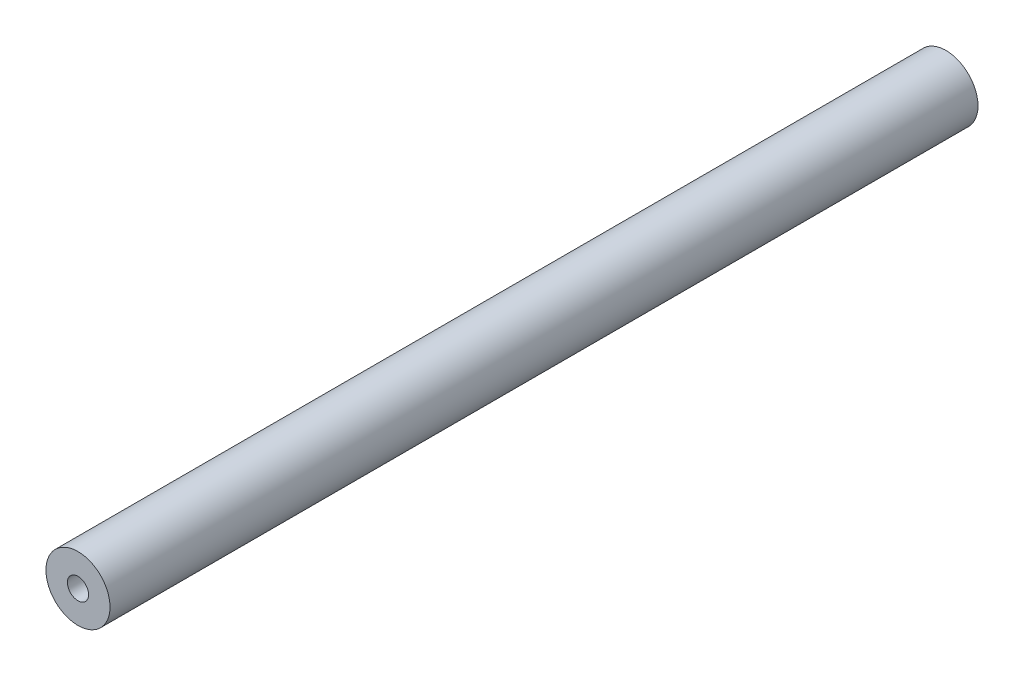
ISO-10303-21;
HEADER;
FILE_DESCRIPTION(('STEP AP214'),'2;1');
FILE_NAME('part.step','',(''),(''),'','','');
FILE_SCHEMA(('AUTOMOTIVE_DESIGN { 1 0 10303 214 1 1 1 1 }'));
ENDSEC;
DATA;
#1=APPLICATION_CONTEXT('core data for automotive mechanical design processes');
#2=APPLICATION_PROTOCOL_DEFINITION('international standard','automotive_design',2000,#1);
#3=PRODUCT_CONTEXT('',#1,'mechanical');
#4=PRODUCT('Part','Part','',(#3));
#5=PRODUCT_RELATED_PRODUCT_CATEGORY('part','',(#4));
#6=PRODUCT_DEFINITION_FORMATION('','',#4);
#7=PRODUCT_DEFINITION_CONTEXT('part definition',#1,'design');
#8=PRODUCT_DEFINITION('design','',#6,#7);
#9=PRODUCT_DEFINITION_SHAPE('','',#8);
#10=(LENGTH_UNIT() NAMED_UNIT(*) SI_UNIT(.MILLI.,.METRE.));
#11=(NAMED_UNIT(*) PLANE_ANGLE_UNIT() SI_UNIT($,.RADIAN.));
#12=(NAMED_UNIT(*) SI_UNIT($,.STERADIAN.) SOLID_ANGLE_UNIT());
#13=UNCERTAINTY_MEASURE_WITH_UNIT(LENGTH_MEASURE(1.E-05),#10,'distance_accuracy_value','');
#14=(GEOMETRIC_REPRESENTATION_CONTEXT(3) GLOBAL_UNCERTAINTY_ASSIGNED_CONTEXT((#13)) GLOBAL_UNIT_ASSIGNED_CONTEXT((#10,
#11,#12)) REPRESENTATION_CONTEXT('',''));
#15=CARTESIAN_POINT('',(0.,0.,0.));
#16=DIRECTION('',(0.,0.,1.));
#17=DIRECTION('',(1.,0.,0.));
#18=AXIS2_PLACEMENT_3D('',#15,#16,#17);
#19=CARTESIAN_POINT('',(0.,0.,135.5));
#20=DIRECTION('',(0.,0.,-1.));
#21=DIRECTION('',(-1.,0.,0.));
#22=AXIS2_PLACEMENT_3D('',#19,#20,#21);
#23=CYLINDRICAL_SURFACE('',#22,5.);
#24=CARTESIAN_POINT('',(0.,0.,135.5));
#25=DIRECTION('',(0.,0.,1.));
#26=DIRECTION('',(1.,0.,0.));
#27=AXIS2_PLACEMENT_3D('',#24,#25,#26);
#28=CIRCLE('',#27,5.);
#29=CARTESIAN_POINT('',(5.,0.,135.5));
#30=VERTEX_POINT('',#29);
#31=EDGE_CURVE('E10',#30,#30,#28,.T.);
#32=ORIENTED_EDGE('',*,*,#31,.F.);
#33=EDGE_LOOP('',(#32));
#34=FACE_BOUND('',#33,.T.);
#35=CARTESIAN_POINT('',(0.,0.,0.));
#36=DIRECTION('',(0.,0.,1.));
#37=DIRECTION('',(1.,0.,0.));
#38=AXIS2_PLACEMENT_3D('',#35,#36,#37);
#39=CIRCLE('',#38,5.);
#40=CARTESIAN_POINT('',(5.,0.,0.));
#41=VERTEX_POINT('',#40);
#42=EDGE_CURVE('E36',#41,#41,#39,.T.);
#43=ORIENTED_EDGE('',*,*,#42,.T.);
#44=EDGE_LOOP('',(#43));
#45=FACE_BOUND('',#44,.T.);
#46=ADVANCED_FACE('F33',(#34,#45),#23,.T.);
#47=CARTESIAN_POINT('',(0.,0.,135.5));
#48=DIRECTION('',(0.,0.,1.));
#49=DIRECTION('',(1.,0.,0.));
#50=AXIS2_PLACEMENT_3D('',#47,#48,#49);
#51=PLANE('',#50);
#52=CARTESIAN_POINT('',(0.,0.,135.5));
#53=DIRECTION('',(0.,0.,1.));
#54=DIRECTION('',(1.,0.,0.));
#55=AXIS2_PLACEMENT_3D('',#52,#53,#54);
#56=CIRCLE('',#55,1.65);
#57=CARTESIAN_POINT('',(1.65,0.,135.5));
#58=VERTEX_POINT('',#57);
#59=EDGE_CURVE('E45',#58,#58,#56,.T.);
#60=ORIENTED_EDGE('',*,*,#59,.F.);
#61=EDGE_LOOP('',(#60));
#62=FACE_BOUND('',#61,.T.);
#63=ORIENTED_EDGE('',*,*,#31,.T.);
#64=EDGE_LOOP('',(#63));
#65=FACE_BOUND('',#64,.T.);
#66=ADVANCED_FACE('F70',(#62,#65),#51,.T.);
#67=CARTESIAN_POINT('',(0.,0.,0.));
#68=DIRECTION('',(0.,0.,1.));
#69=DIRECTION('',(1.,0.,0.));
#70=AXIS2_PLACEMENT_3D('',#67,#68,#69);
#71=PLANE('',#70);
#72=CARTESIAN_POINT('',(0.,0.,0.));
#73=DIRECTION('',(0.,0.,-1.));
#74=DIRECTION('',(-1.,0.,0.));
#75=AXIS2_PLACEMENT_3D('',#72,#73,#74);
#76=CIRCLE('',#75,1.65);
#77=CARTESIAN_POINT('',(-1.65,0.,0.));
#78=VERTEX_POINT('',#77);
#79=EDGE_CURVE('E51',#78,#78,#76,.T.);
#80=ORIENTED_EDGE('',*,*,#79,.F.);
#81=EDGE_LOOP('',(#80));
#82=FACE_BOUND('',#81,.T.);
#83=ORIENTED_EDGE('',*,*,#42,.F.);
#84=EDGE_LOOP('',(#83));
#85=FACE_BOUND('',#84,.T.);
#86=ADVANCED_FACE('F66',(#82,#85),#71,.F.);
#87=CARTESIAN_POINT('',(0.,0.,125.5));
#88=DIRECTION('',(0.,0.,1.));
#89=DIRECTION('',(1.,0.,0.));
#90=AXIS2_PLACEMENT_3D('',#87,#88,#89);
#91=CYLINDRICAL_SURFACE('',#90,1.65);
#92=CARTESIAN_POINT('',(0.,0.,125.5));
#93=DIRECTION('',(0.,0.,1.));
#94=DIRECTION('',(1.,0.,0.));
#95=AXIS2_PLACEMENT_3D('',#92,#93,#94);
#96=CIRCLE('',#95,1.65);
#97=CARTESIAN_POINT('',(1.65,0.,125.5));
#98=VERTEX_POINT('',#97);
#99=EDGE_CURVE('E43',#98,#98,#96,.T.);
#100=ORIENTED_EDGE('',*,*,#99,.F.);
#101=EDGE_LOOP('',(#100));
#102=FACE_BOUND('',#101,.T.);
#103=ORIENTED_EDGE('',*,*,#59,.T.);
#104=EDGE_LOOP('',(#103));
#105=FACE_BOUND('',#104,.T.);
#106=ADVANCED_FACE('F69',(#102,#105),#91,.F.);
#107=CARTESIAN_POINT('',(0.,0.,125.5));
#108=DIRECTION('',(0.,0.,1.));
#109=DIRECTION('',(1.,0.,0.));
#110=AXIS2_PLACEMENT_3D('',#107,#108,#109);
#111=PLANE('',#110);
#112=ORIENTED_EDGE('',*,*,#99,.T.);
#113=EDGE_LOOP('',(#112));
#114=FACE_BOUND('',#113,.T.);
#115=ADVANCED_FACE('F62',(#114),#111,.T.);
#116=CARTESIAN_POINT('',(0.,0.,10.));
#117=DIRECTION('',(0.,0.,-1.));
#118=DIRECTION('',(-1.,0.,0.));
#119=AXIS2_PLACEMENT_3D('',#116,#117,#118);
#120=CYLINDRICAL_SURFACE('',#119,1.65);
#121=CARTESIAN_POINT('',(0.,0.,10.));
#122=DIRECTION('',(0.,0.,-1.));
#123=DIRECTION('',(-1.,0.,0.));
#124=AXIS2_PLACEMENT_3D('',#121,#122,#123);
#125=CIRCLE('',#124,1.65);
#126=CARTESIAN_POINT('',(-1.65,0.,10.));
#127=VERTEX_POINT('',#126);
#128=EDGE_CURVE('E48',#127,#127,#125,.T.);
#129=ORIENTED_EDGE('',*,*,#128,.F.);
#130=EDGE_LOOP('',(#129));
#131=FACE_BOUND('',#130,.T.);
#132=ORIENTED_EDGE('',*,*,#79,.T.);
#133=EDGE_LOOP('',(#132));
#134=FACE_BOUND('',#133,.T.);
#135=ADVANCED_FACE('F59',(#131,#134),#120,.F.);
#136=CARTESIAN_POINT('',(0.,0.,10.));
#137=DIRECTION('',(0.,0.,-1.));
#138=DIRECTION('',(-1.,0.,0.));
#139=AXIS2_PLACEMENT_3D('',#136,#137,#138);
#140=PLANE('',#139);
#141=ORIENTED_EDGE('',*,*,#128,.T.);
#142=EDGE_LOOP('',(#141));
#143=FACE_BOUND('',#142,.T.);
#144=ADVANCED_FACE('F57',(#143),#140,.T.);
#145=CLOSED_SHELL('',(#46,#66,#86,#106,#115,#135,#144));
#146=MANIFOLD_SOLID_BREP('B2',#145);
#147=ADVANCED_BREP_SHAPE_REPRESENTATION('',(#18,#146),#14);
#148=SHAPE_DEFINITION_REPRESENTATION(#9,#147);
ENDSEC;
END-ISO-10303-21;
